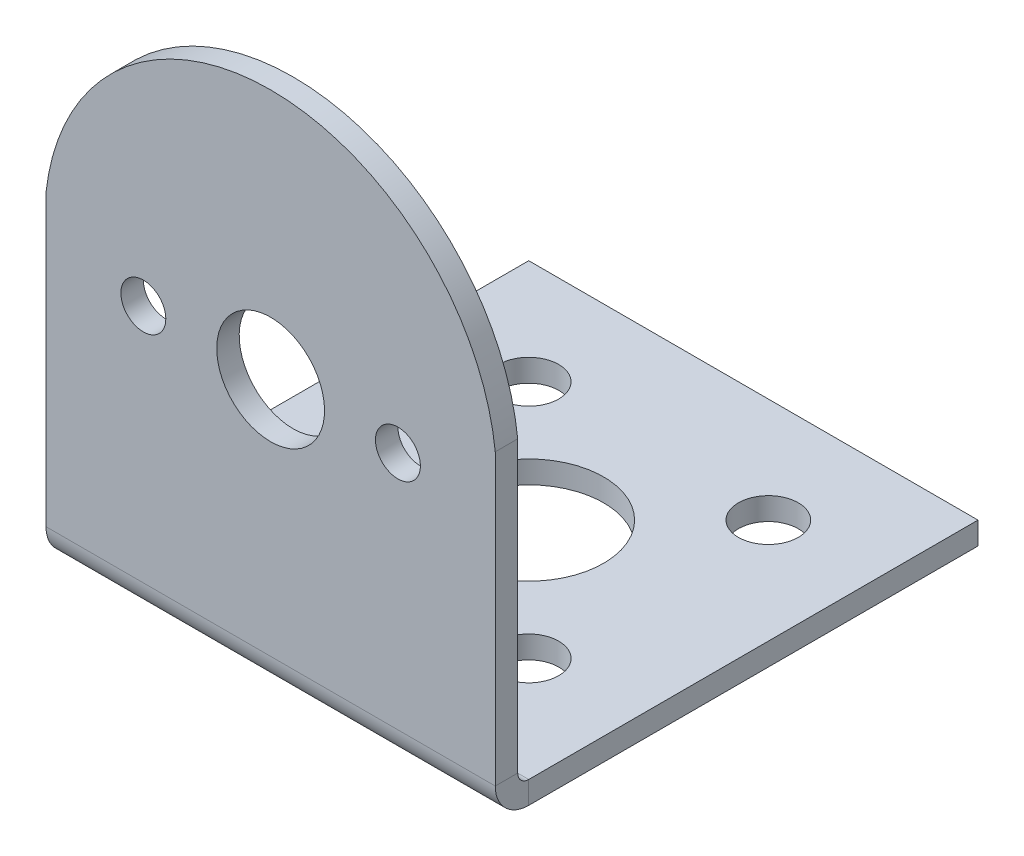
ISO-10303-21;
HEADER;
FILE_DESCRIPTION(('STEP AP214'),'2;1');
FILE_NAME('part.step','',(''),(''),'','','');
FILE_SCHEMA(('AUTOMOTIVE_DESIGN { 1 0 10303 214 1 1 1 1 }'));
ENDSEC;
DATA;
#1=APPLICATION_CONTEXT('core data for automotive mechanical design processes');
#2=APPLICATION_PROTOCOL_DEFINITION('international standard','automotive_design',2000,#1);
#3=PRODUCT_CONTEXT('',#1,'mechanical');
#4=PRODUCT('Part','Part','',(#3));
#5=PRODUCT_RELATED_PRODUCT_CATEGORY('part','',(#4));
#6=PRODUCT_DEFINITION_FORMATION('','',#4);
#7=PRODUCT_DEFINITION_CONTEXT('part definition',#1,'design');
#8=PRODUCT_DEFINITION('design','',#6,#7);
#9=PRODUCT_DEFINITION_SHAPE('','',#8);
#10=(LENGTH_UNIT() NAMED_UNIT(*) SI_UNIT(.MILLI.,.METRE.));
#11=(NAMED_UNIT(*) PLANE_ANGLE_UNIT() SI_UNIT($,.RADIAN.));
#12=(NAMED_UNIT(*) SI_UNIT($,.STERADIAN.) SOLID_ANGLE_UNIT());
#13=UNCERTAINTY_MEASURE_WITH_UNIT(LENGTH_MEASURE(1.E-05),#10,'distance_accuracy_value','');
#14=(GEOMETRIC_REPRESENTATION_CONTEXT(3) GLOBAL_UNCERTAINTY_ASSIGNED_CONTEXT((#13)) GLOBAL_UNIT_ASSIGNED_CONTEXT((#10,
#11,#12)) REPRESENTATION_CONTEXT('',''));
#15=CARTESIAN_POINT('',(0.,0.,0.));
#16=DIRECTION('',(0.,0.,1.));
#17=DIRECTION('',(1.,0.,0.));
#18=AXIS2_PLACEMENT_3D('',#15,#16,#17);
#19=CARTESIAN_POINT('',(-15.,-1.5,15.));
#20=DIRECTION('',(-1.,0.,0.));
#21=DIRECTION('',(0.,0.,1.));
#22=AXIS2_PLACEMENT_3D('',#19,#20,#21);
#23=PLANE('',#22);
#24=DIRECTION('',(0.,0.,1.));
#25=VECTOR('',#24,1.);
#26=CARTESIAN_POINT('',(-15.,0.,15.));
#27=LINE('',#26,#25);
#28=CARTESIAN_POINT('',(-15.,0.,-15.));
#29=VERTEX_POINT('',#28);
#30=CARTESIAN_POINT('',(-15.,0.,15.));
#31=VERTEX_POINT('',#30);
#32=EDGE_CURVE('E245',#29,#31,#27,.T.);
#33=ORIENTED_EDGE('',*,*,#32,.F.);
#34=DIRECTION('',(0.,1.,0.));
#35=VECTOR('',#34,1.);
#36=CARTESIAN_POINT('',(-15.,-1.5,-15.));
#37=LINE('',#36,#35);
#38=CARTESIAN_POINT('',(-15.,-1.5,-15.));
#39=VERTEX_POINT('',#38);
#40=EDGE_CURVE('E13',#39,#29,#37,.T.);
#41=ORIENTED_EDGE('',*,*,#40,.F.);
#42=DIRECTION('',(0.,0.,1.));
#43=VECTOR('',#42,1.);
#44=CARTESIAN_POINT('',(-15.,-1.5,15.));
#45=LINE('',#44,#43);
#46=CARTESIAN_POINT('',(-15.,-1.5,15.));
#47=VERTEX_POINT('',#46);
#48=EDGE_CURVE('E248',#39,#47,#45,.T.);
#49=ORIENTED_EDGE('',*,*,#48,.T.);
#50=DIRECTION('',(0.,1.,0.));
#51=VECTOR('',#50,1.);
#52=CARTESIAN_POINT('',(-15.,-1.5,15.));
#53=LINE('',#52,#51);
#54=EDGE_CURVE('E74',#47,#31,#53,.T.);
#55=ORIENTED_EDGE('',*,*,#54,.T.);
#56=EDGE_LOOP('',(#33,#41,#49,#55));
#57=FACE_BOUND('',#56,.T.);
#58=ADVANCED_FACE('F71',(#57),#23,.T.);
#59=CARTESIAN_POINT('',(15.,-1.5,-15.));
#60=DIRECTION('',(0.,0.,-1.));
#61=DIRECTION('',(-1.,0.,0.));
#62=AXIS2_PLACEMENT_3D('',#59,#60,#61);
#63=PLANE('',#62);
#64=DIRECTION('',(-1.,0.,0.));
#65=VECTOR('',#64,1.);
#66=CARTESIAN_POINT('',(15.,0.,-15.));
#67=LINE('',#66,#65);
#68=CARTESIAN_POINT('',(15.,0.,-15.));
#69=VERTEX_POINT('',#68);
#70=EDGE_CURVE('E250',#69,#29,#67,.T.);
#71=ORIENTED_EDGE('',*,*,#70,.F.);
#72=DIRECTION('',(0.,1.,0.));
#73=VECTOR('',#72,1.);
#74=CARTESIAN_POINT('',(15.,-1.5,-15.));
#75=LINE('',#74,#73);
#76=CARTESIAN_POINT('',(15.,-1.5,-15.));
#77=VERTEX_POINT('',#76);
#78=EDGE_CURVE('E80',#77,#69,#75,.T.);
#79=ORIENTED_EDGE('',*,*,#78,.F.);
#80=DIRECTION('',(-1.,0.,0.));
#81=VECTOR('',#80,1.);
#82=CARTESIAN_POINT('',(15.,-1.5,-15.));
#83=LINE('',#82,#81);
#84=EDGE_CURVE('E254',#77,#39,#83,.T.);
#85=ORIENTED_EDGE('',*,*,#84,.T.);
#86=ORIENTED_EDGE('',*,*,#40,.T.);
#87=EDGE_LOOP('',(#71,#79,#85,#86));
#88=FACE_BOUND('',#87,.T.);
#89=ADVANCED_FACE('F301',(#88),#63,.T.);
#90=CARTESIAN_POINT('',(15.,-1.5,15.));
#91=DIRECTION('',(1.,0.,0.));
#92=DIRECTION('',(0.,0.,-1.));
#93=AXIS2_PLACEMENT_3D('',#90,#91,#92);
#94=PLANE('',#93);
#95=DIRECTION('',(0.,0.,-1.));
#96=VECTOR('',#95,1.);
#97=CARTESIAN_POINT('',(15.,0.,15.));
#98=LINE('',#97,#96);
#99=CARTESIAN_POINT('',(15.,0.,15.));
#100=VERTEX_POINT('',#99);
#101=EDGE_CURVE('E261',#100,#69,#98,.T.);
#102=ORIENTED_EDGE('',*,*,#101,.F.);
#103=DIRECTION('',(0.,1.,0.));
#104=VECTOR('',#103,1.);
#105=CARTESIAN_POINT('',(15.,-1.5,15.));
#106=LINE('',#105,#104);
#107=CARTESIAN_POINT('',(15.,-1.50000000000001,15.));
#108=VERTEX_POINT('',#107);
#109=EDGE_CURVE('E265',#108,#100,#106,.T.);
#110=ORIENTED_EDGE('',*,*,#109,.F.);
#111=DIRECTION('',(0.,0.,-1.));
#112=VECTOR('',#111,1.);
#113=CARTESIAN_POINT('',(15.,-1.5,15.));
#114=LINE('',#113,#112);
#115=EDGE_CURVE('E252',#108,#77,#114,.T.);
#116=ORIENTED_EDGE('',*,*,#115,.T.);
#117=ORIENTED_EDGE('',*,*,#78,.T.);
#118=EDGE_LOOP('',(#102,#110,#116,#117));
#119=FACE_BOUND('',#118,.T.);
#120=ADVANCED_FACE('F305',(#119),#94,.T.);
#121=CARTESIAN_POINT('',(0.,-1.5,0.));
#122=DIRECTION('',(0.,1.,0.));
#123=DIRECTION('',(0.,0.,1.));
#124=AXIS2_PLACEMENT_3D('',#121,#122,#123);
#125=PLANE('',#124);
#126=CARTESIAN_POINT('',(-8.,-1.5,-7.99999999999999));
#127=DIRECTION('',(0.,1.,0.));
#128=DIRECTION('',(0.,0.,-1.));
#129=AXIS2_PLACEMENT_3D('',#126,#127,#128);
#130=CIRCLE('',#129,2.);
#131=CARTESIAN_POINT('',(-8.,-1.5,-9.99999999999999));
#132=VERTEX_POINT('',#131);
#133=EDGE_CURVE('E218',#132,#132,#130,.T.);
#134=ORIENTED_EDGE('',*,*,#133,.T.);
#135=EDGE_LOOP('',(#134));
#136=FACE_BOUND('',#135,.T.);
#137=CARTESIAN_POINT('',(-8.,-1.5,8.));
#138=DIRECTION('',(0.,1.,0.));
#139=DIRECTION('',(0.,0.,-1.));
#140=AXIS2_PLACEMENT_3D('',#137,#138,#139);
#141=CIRCLE('',#140,2.);
#142=CARTESIAN_POINT('',(-8.,-1.5,6.));
#143=VERTEX_POINT('',#142);
#144=EDGE_CURVE('E224',#143,#143,#141,.T.);
#145=ORIENTED_EDGE('',*,*,#144,.T.);
#146=EDGE_LOOP('',(#145));
#147=FACE_BOUND('',#146,.T.);
#148=CARTESIAN_POINT('',(8.,-1.5,8.));
#149=DIRECTION('',(0.,1.,0.));
#150=DIRECTION('',(0.,0.,1.));
#151=AXIS2_PLACEMENT_3D('',#148,#149,#150);
#152=CIRCLE('',#151,2.);
#153=CARTESIAN_POINT('',(8.,-1.5,10.));
#154=VERTEX_POINT('',#153);
#155=EDGE_CURVE('E230',#154,#154,#152,.T.);
#156=ORIENTED_EDGE('',*,*,#155,.T.);
#157=EDGE_LOOP('',(#156));
#158=FACE_BOUND('',#157,.T.);
#159=CARTESIAN_POINT('',(8.,-1.5,-7.99999999999999));
#160=DIRECTION('',(0.,1.,0.));
#161=DIRECTION('',(0.,0.,1.));
#162=AXIS2_PLACEMENT_3D('',#159,#160,#161);
#163=CIRCLE('',#162,2.);
#164=CARTESIAN_POINT('',(8.,-1.5,-5.99999999999999));
#165=VERTEX_POINT('',#164);
#166=EDGE_CURVE('E236',#165,#165,#163,.T.);
#167=ORIENTED_EDGE('',*,*,#166,.T.);
#168=EDGE_LOOP('',(#167));
#169=FACE_BOUND('',#168,.T.);
#170=CARTESIAN_POINT('',(0.,-1.5,0.));
#171=DIRECTION('',(0.,1.,0.));
#172=DIRECTION('',(0.,0.,1.));
#173=AXIS2_PLACEMENT_3D('',#170,#171,#172);
#174=CIRCLE('',#173,5.);
#175=CARTESIAN_POINT('',(0.,-1.5,5.));
#176=VERTEX_POINT('',#175);
#177=EDGE_CURVE('E242',#176,#176,#174,.T.);
#178=ORIENTED_EDGE('',*,*,#177,.T.);
#179=EDGE_LOOP('',(#178));
#180=FACE_BOUND('',#179,.T.);
#181=ORIENTED_EDGE('',*,*,#48,.F.);
#182=ORIENTED_EDGE('',*,*,#84,.F.);
#183=ORIENTED_EDGE('',*,*,#115,.F.);
#184=DIRECTION('',(1.,0.,0.));
#185=VECTOR('',#184,1.);
#186=CARTESIAN_POINT('',(15.,-1.5,15.));
#187=LINE('',#186,#185);
#188=EDGE_CURVE('E112',#47,#108,#187,.T.);
#189=ORIENTED_EDGE('',*,*,#188,.F.);
#190=EDGE_LOOP('',(#181,#182,#183,#189));
#191=FACE_BOUND('',#190,.T.);
#192=ADVANCED_FACE('F310',(#136,#147,#158,#169,#180,#191),#125,.F.);
#193=CARTESIAN_POINT('',(0.,0.,0.));
#194=DIRECTION('',(0.,1.,0.));
#195=DIRECTION('',(0.,0.,1.));
#196=AXIS2_PLACEMENT_3D('',#193,#194,#195);
#197=PLANE('',#196);
#198=CARTESIAN_POINT('',(-8.,0.,-7.99999999999999));
#199=DIRECTION('',(0.,1.,0.));
#200=DIRECTION('',(0.,0.,-1.));
#201=AXIS2_PLACEMENT_3D('',#198,#199,#200);
#202=CIRCLE('',#201,2.);
#203=CARTESIAN_POINT('',(-8.,0.,-9.99999999999999));
#204=VERTEX_POINT('',#203);
#205=EDGE_CURVE('E213',#204,#204,#202,.T.);
#206=ORIENTED_EDGE('',*,*,#205,.F.);
#207=EDGE_LOOP('',(#206));
#208=FACE_BOUND('',#207,.T.);
#209=CARTESIAN_POINT('',(-8.,0.,8.));
#210=DIRECTION('',(0.,1.,0.));
#211=DIRECTION('',(0.,0.,-1.));
#212=AXIS2_PLACEMENT_3D('',#209,#210,#211);
#213=CIRCLE('',#212,2.);
#214=CARTESIAN_POINT('',(-8.,0.,6.));
#215=VERTEX_POINT('',#214);
#216=EDGE_CURVE('E221',#215,#215,#213,.T.);
#217=ORIENTED_EDGE('',*,*,#216,.F.);
#218=EDGE_LOOP('',(#217));
#219=FACE_BOUND('',#218,.T.);
#220=CARTESIAN_POINT('',(8.,0.,8.));
#221=DIRECTION('',(0.,1.,0.));
#222=DIRECTION('',(0.,0.,1.));
#223=AXIS2_PLACEMENT_3D('',#220,#221,#222);
#224=CIRCLE('',#223,2.);
#225=CARTESIAN_POINT('',(8.,0.,10.));
#226=VERTEX_POINT('',#225);
#227=EDGE_CURVE('E227',#226,#226,#224,.T.);
#228=ORIENTED_EDGE('',*,*,#227,.F.);
#229=EDGE_LOOP('',(#228));
#230=FACE_BOUND('',#229,.T.);
#231=CARTESIAN_POINT('',(8.,0.,-7.99999999999999));
#232=DIRECTION('',(0.,1.,0.));
#233=DIRECTION('',(0.,0.,1.));
#234=AXIS2_PLACEMENT_3D('',#231,#232,#233);
#235=CIRCLE('',#234,2.);
#236=CARTESIAN_POINT('',(8.,0.,-5.99999999999999));
#237=VERTEX_POINT('',#236);
#238=EDGE_CURVE('E233',#237,#237,#235,.T.);
#239=ORIENTED_EDGE('',*,*,#238,.F.);
#240=EDGE_LOOP('',(#239));
#241=FACE_BOUND('',#240,.T.);
#242=CARTESIAN_POINT('',(0.,0.,0.));
#243=DIRECTION('',(0.,1.,0.));
#244=DIRECTION('',(0.,0.,1.));
#245=AXIS2_PLACEMENT_3D('',#242,#243,#244);
#246=CIRCLE('',#245,5.);
#247=CARTESIAN_POINT('',(0.,0.,5.));
#248=VERTEX_POINT('',#247);
#249=EDGE_CURVE('E239',#248,#248,#246,.T.);
#250=ORIENTED_EDGE('',*,*,#249,.F.);
#251=EDGE_LOOP('',(#250));
#252=FACE_BOUND('',#251,.T.);
#253=ORIENTED_EDGE('',*,*,#32,.T.);
#254=DIRECTION('',(1.,0.,0.));
#255=VECTOR('',#254,1.);
#256=CARTESIAN_POINT('',(15.,0.,15.));
#257=LINE('',#256,#255);
#258=EDGE_CURVE('E258',#31,#100,#257,.T.);
#259=ORIENTED_EDGE('',*,*,#258,.T.);
#260=ORIENTED_EDGE('',*,*,#101,.T.);
#261=ORIENTED_EDGE('',*,*,#70,.T.);
#262=EDGE_LOOP('',(#253,#259,#260,#261));
#263=FACE_BOUND('',#262,.T.);
#264=ADVANCED_FACE('F272',(#208,#219,#230,#241,#252,#263),#197,.T.);
#265=CARTESIAN_POINT('',(0.,-1.5,0.));
#266=DIRECTION('',(0.,1.,0.));
#267=DIRECTION('',(0.,0.,1.));
#268=AXIS2_PLACEMENT_3D('',#265,#266,#267);
#269=CYLINDRICAL_SURFACE('',#268,5.);
#270=ORIENTED_EDGE('',*,*,#177,.F.);
#271=EDGE_LOOP('',(#270));
#272=FACE_BOUND('',#271,.T.);
#273=ORIENTED_EDGE('',*,*,#249,.T.);
#274=EDGE_LOOP('',(#273));
#275=FACE_BOUND('',#274,.T.);
#276=ADVANCED_FACE('F314',(#272,#275),#269,.F.);
#277=CARTESIAN_POINT('',(8.,-1.5,-7.99999999999999));
#278=DIRECTION('',(0.,1.,0.));
#279=DIRECTION('',(0.,0.,1.));
#280=AXIS2_PLACEMENT_3D('',#277,#278,#279);
#281=CYLINDRICAL_SURFACE('',#280,2.);
#282=ORIENTED_EDGE('',*,*,#166,.F.);
#283=EDGE_LOOP('',(#282));
#284=FACE_BOUND('',#283,.T.);
#285=ORIENTED_EDGE('',*,*,#238,.T.);
#286=EDGE_LOOP('',(#285));
#287=FACE_BOUND('',#286,.T.);
#288=ADVANCED_FACE('F321',(#284,#287),#281,.F.);
#289=CARTESIAN_POINT('',(8.,-1.5,8.));
#290=DIRECTION('',(0.,1.,0.));
#291=DIRECTION('',(0.,0.,1.));
#292=AXIS2_PLACEMENT_3D('',#289,#290,#291);
#293=CYLINDRICAL_SURFACE('',#292,2.);
#294=ORIENTED_EDGE('',*,*,#155,.F.);
#295=EDGE_LOOP('',(#294));
#296=FACE_BOUND('',#295,.T.);
#297=ORIENTED_EDGE('',*,*,#227,.T.);
#298=EDGE_LOOP('',(#297));
#299=FACE_BOUND('',#298,.T.);
#300=ADVANCED_FACE('F325',(#296,#299),#293,.F.);
#301=CARTESIAN_POINT('',(-8.,-1.5,8.));
#302=DIRECTION('',(0.,1.,0.));
#303=DIRECTION('',(0.,0.,1.));
#304=AXIS2_PLACEMENT_3D('',#301,#302,#303);
#305=CYLINDRICAL_SURFACE('',#304,2.);
#306=ORIENTED_EDGE('',*,*,#144,.F.);
#307=EDGE_LOOP('',(#306));
#308=FACE_BOUND('',#307,.T.);
#309=ORIENTED_EDGE('',*,*,#216,.T.);
#310=EDGE_LOOP('',(#309));
#311=FACE_BOUND('',#310,.T.);
#312=ADVANCED_FACE('F329',(#308,#311),#305,.F.);
#313=CARTESIAN_POINT('',(-8.,-1.5,-7.99999999999999));
#314=DIRECTION('',(0.,1.,0.));
#315=DIRECTION('',(0.,0.,1.));
#316=AXIS2_PLACEMENT_3D('',#313,#314,#315);
#317=CYLINDRICAL_SURFACE('',#316,2.);
#318=ORIENTED_EDGE('',*,*,#133,.F.);
#319=EDGE_LOOP('',(#318));
#320=FACE_BOUND('',#319,.T.);
#321=ORIENTED_EDGE('',*,*,#205,.T.);
#322=EDGE_LOOP('',(#321));
#323=FACE_BOUND('',#322,.T.);
#324=ADVANCED_FACE('F333',(#320,#323),#317,.F.);
#325=CARTESIAN_POINT('',(-15.,0.736599999999997,15.));
#326=DIRECTION('',(-1.,0.,0.));
#327=DIRECTION('',(0.,-1.,0.));
#328=AXIS2_PLACEMENT_3D('',#325,#326,#327);
#329=PLANE('',#328);
#330=DIRECTION('',(0.,0.,1.));
#331=VECTOR('',#330,1.);
#332=CARTESIAN_POINT('',(-15.,0.736599999999997,17.2366000000001));
#333=LINE('',#332,#331);
#334=CARTESIAN_POINT('',(-15.,0.736599999999995,15.7366));
#335=VERTEX_POINT('',#334);
#336=CARTESIAN_POINT('',(-15.,0.73659999999999,17.2366));
#337=VERTEX_POINT('',#336);
#338=EDGE_CURVE('E210',#335,#337,#333,.T.);
#339=ORIENTED_EDGE('',*,*,#338,.F.);
#340=CARTESIAN_POINT('',(-15.,0.736599999999997,15.));
#341=DIRECTION('',(1.,0.,0.));
#342=DIRECTION('',(0.,1.,0.));
#343=AXIS2_PLACEMENT_3D('',#340,#341,#342);
#344=CIRCLE('',#343,0.736600000000004);
#345=EDGE_CURVE('E150',#31,#335,#344,.F.);
#346=ORIENTED_EDGE('',*,*,#345,.F.);
#347=ORIENTED_EDGE('',*,*,#54,.F.);
#348=CARTESIAN_POINT('',(-15.,0.736599999999997,15.));
#349=DIRECTION('',(1.,0.,0.));
#350=DIRECTION('',(0.,1.,0.));
#351=AXIS2_PLACEMENT_3D('',#348,#349,#350);
#352=CIRCLE('',#351,2.2366);
#353=EDGE_CURVE('E149',#47,#337,#352,.F.);
#354=ORIENTED_EDGE('',*,*,#353,.T.);
#355=EDGE_LOOP('',(#339,#346,#347,#354));
#356=FACE_BOUND('',#355,.T.);
#357=ADVANCED_FACE('F276',(#356),#329,.T.);
#358=CARTESIAN_POINT('',(15.,0.736599999999993,15.));
#359=DIRECTION('',(-1.,0.,0.));
#360=DIRECTION('',(0.,-1.,0.));
#361=AXIS2_PLACEMENT_3D('',#358,#359,#360);
#362=PLANE('',#361);
#363=CARTESIAN_POINT('',(15.,0.736599999999993,15.));
#364=DIRECTION('',(1.,0.,0.));
#365=DIRECTION('',(0.,1.,0.));
#366=AXIS2_PLACEMENT_3D('',#363,#364,#365);
#367=CIRCLE('',#366,0.736600000000004);
#368=CARTESIAN_POINT('',(15.,0.73659999999999,15.7366));
#369=VERTEX_POINT('',#368);
#370=EDGE_CURVE('E157',#369,#100,#367,.T.);
#371=ORIENTED_EDGE('',*,*,#370,.F.);
#372=DIRECTION('',(0.,0.,1.));
#373=VECTOR('',#372,1.);
#374=CARTESIAN_POINT('',(15.,0.736599999999993,15.7366));
#375=LINE('',#374,#373);
#376=CARTESIAN_POINT('',(15.,0.736599999999993,17.2366));
#377=VERTEX_POINT('',#376);
#378=EDGE_CURVE('E154',#369,#377,#375,.T.);
#379=ORIENTED_EDGE('',*,*,#378,.T.);
#380=CARTESIAN_POINT('',(15.,0.736599999999993,15.));
#381=DIRECTION('',(1.,0.,0.));
#382=DIRECTION('',(0.,1.,0.));
#383=AXIS2_PLACEMENT_3D('',#380,#381,#382);
#384=CIRCLE('',#383,2.2366);
#385=EDGE_CURVE('E140',#377,#108,#384,.T.);
#386=ORIENTED_EDGE('',*,*,#385,.T.);
#387=ORIENTED_EDGE('',*,*,#109,.T.);
#388=EDGE_LOOP('',(#371,#379,#386,#387));
#389=FACE_BOUND('',#388,.T.);
#390=ADVANCED_FACE('F155',(#389),#362,.F.);
#391=CARTESIAN_POINT('',(15.,0.736599999999993,15.));
#392=DIRECTION('',(1.,0.,0.));
#393=DIRECTION('',(0.,0.,1.));
#394=AXIS2_PLACEMENT_3D('',#391,#392,#393);
#395=CYLINDRICAL_SURFACE('',#394,2.2366);
#396=ORIENTED_EDGE('',*,*,#188,.T.);
#397=ORIENTED_EDGE('',*,*,#385,.F.);
#398=DIRECTION('',(1.,0.,0.));
#399=VECTOR('',#398,1.);
#400=CARTESIAN_POINT('',(0.,0.736599999999993,17.2366));
#401=LINE('',#400,#399);
#402=EDGE_CURVE('E145',#337,#377,#401,.T.);
#403=ORIENTED_EDGE('',*,*,#402,.F.);
#404=ORIENTED_EDGE('',*,*,#353,.F.);
#405=EDGE_LOOP('',(#396,#397,#403,#404));
#406=FACE_BOUND('',#405,.T.);
#407=ADVANCED_FACE('F142',(#406),#395,.T.);
#408=CARTESIAN_POINT('',(15.,0.736599999999993,15.));
#409=DIRECTION('',(1.,0.,0.));
#410=DIRECTION('',(0.,0.,1.));
#411=AXIS2_PLACEMENT_3D('',#408,#409,#410);
#412=CYLINDRICAL_SURFACE('',#411,0.736600000000004);
#413=ORIENTED_EDGE('',*,*,#258,.F.);
#414=ORIENTED_EDGE('',*,*,#345,.T.);
#415=DIRECTION('',(-1.,0.,0.));
#416=VECTOR('',#415,1.);
#417=CARTESIAN_POINT('',(-15.,0.736599999999997,15.7366));
#418=LINE('',#417,#416);
#419=EDGE_CURVE('E162',#335,#369,#418,.F.);
#420=ORIENTED_EDGE('',*,*,#419,.T.);
#421=ORIENTED_EDGE('',*,*,#370,.T.);
#422=EDGE_LOOP('',(#413,#414,#420,#421));
#423=FACE_BOUND('',#422,.T.);
#424=ADVANCED_FACE('F274',(#423),#412,.F.);
#425=CARTESIAN_POINT('',(15.,0.,17.2366));
#426=DIRECTION('',(1.,0.,0.));
#427=DIRECTION('',(0.,0.,-1.));
#428=AXIS2_PLACEMENT_3D('',#425,#426,#427);
#429=PLANE('',#428);
#430=DIRECTION('',(0.,-1.,0.));
#431=VECTOR('',#430,1.);
#432=CARTESIAN_POINT('',(15.,0.,17.2366));
#433=LINE('',#432,#431);
#434=CARTESIAN_POINT('',(15.,20.0671641791044,17.2366000000001));
#435=VERTEX_POINT('',#434);
#436=EDGE_CURVE('E169',#435,#377,#433,.T.);
#437=ORIENTED_EDGE('',*,*,#436,.T.);
#438=ORIENTED_EDGE('',*,*,#378,.F.);
#439=DIRECTION('',(0.,1.,0.));
#440=VECTOR('',#439,1.);
#441=CARTESIAN_POINT('',(15.,18.4085820895522,15.7366000000001));
#442=LINE('',#441,#440);
#443=CARTESIAN_POINT('',(15.,20.0671641791044,15.7366000000001));
#444=VERTEX_POINT('',#443);
#445=EDGE_CURVE('E185',#444,#369,#442,.F.);
#446=ORIENTED_EDGE('',*,*,#445,.F.);
#447=DIRECTION('',(0.,0.,-1.));
#448=VECTOR('',#447,1.);
#449=CARTESIAN_POINT('',(15.,20.0671641791044,17.2366000000001));
#450=LINE('',#449,#448);
#451=EDGE_CURVE('E174',#435,#444,#450,.T.);
#452=ORIENTED_EDGE('',*,*,#451,.F.);
#453=EDGE_LOOP('',(#437,#438,#446,#452));
#454=FACE_BOUND('',#453,.T.);
#455=ADVANCED_FACE('F173',(#454),#429,.T.);
#456=CARTESIAN_POINT('',(-15.,20.0671641791044,17.2366000000001));
#457=DIRECTION('',(-1.,0.,0.));
#458=DIRECTION('',(0.,-1.,0.));
#459=AXIS2_PLACEMENT_3D('',#456,#457,#458);
#460=PLANE('',#459);
#461=DIRECTION('',(0.,-1.,0.));
#462=VECTOR('',#461,1.);
#463=CARTESIAN_POINT('',(-15.,18.4085820895522,15.7366000000001));
#464=LINE('',#463,#462);
#465=CARTESIAN_POINT('',(-15.,20.0671641791044,15.7366000000001));
#466=VERTEX_POINT('',#465);
#467=EDGE_CURVE('E190',#335,#466,#464,.F.);
#468=ORIENTED_EDGE('',*,*,#467,.F.);
#469=ORIENTED_EDGE('',*,*,#338,.T.);
#470=DIRECTION('',(0.,1.,0.));
#471=VECTOR('',#470,1.);
#472=CARTESIAN_POINT('',(-15.,20.0671641791044,17.2366000000001));
#473=LINE('',#472,#471);
#474=CARTESIAN_POINT('',(-15.,20.0671641791044,17.2366000000001));
#475=VERTEX_POINT('',#474);
#476=EDGE_CURVE('E170',#337,#475,#473,.T.);
#477=ORIENTED_EDGE('',*,*,#476,.T.);
#478=DIRECTION('',(0.,0.,-1.));
#479=VECTOR('',#478,1.);
#480=CARTESIAN_POINT('',(-15.,20.0671641791044,17.2366000000001));
#481=LINE('',#480,#479);
#482=EDGE_CURVE('E176',#475,#466,#481,.T.);
#483=ORIENTED_EDGE('',*,*,#482,.T.);
#484=EDGE_LOOP('',(#468,#469,#477,#483));
#485=FACE_BOUND('',#484,.T.);
#486=ADVANCED_FACE('F279',(#485),#460,.T.);
#487=CARTESIAN_POINT('',(0.,18.4085820895522,17.2366000000001));
#488=DIRECTION('',(0.,0.,1.));
#489=DIRECTION('',(0.,-1.,0.));
#490=AXIS2_PLACEMENT_3D('',#487,#488,#489);
#491=PLANE('',#490);
#492=CARTESIAN_POINT('',(-8.5,16.7499999999999,17.2366000000001));
#493=DIRECTION('',(0.,0.,1.));
#494=DIRECTION('',(0.,-1.,0.));
#495=AXIS2_PLACEMENT_3D('',#492,#493,#494);
#496=CIRCLE('',#495,1.5);
#497=CARTESIAN_POINT('',(-8.5,15.2499999999999,17.2366));
#498=VERTEX_POINT('',#497);
#499=EDGE_CURVE('E204',#498,#498,#496,.F.);
#500=ORIENTED_EDGE('',*,*,#499,.T.);
#501=EDGE_LOOP('',(#500));
#502=FACE_BOUND('',#501,.T.);
#503=CARTESIAN_POINT('',(8.5,16.7499999999999,17.2366000000001));
#504=DIRECTION('',(0.,0.,1.));
#505=DIRECTION('',(0.,-1.,0.));
#506=AXIS2_PLACEMENT_3D('',#503,#504,#505);
#507=CIRCLE('',#506,1.5);
#508=CARTESIAN_POINT('',(8.5,15.2499999999999,17.2366));
#509=VERTEX_POINT('',#508);
#510=EDGE_CURVE('E198',#509,#509,#507,.F.);
#511=ORIENTED_EDGE('',*,*,#510,.T.);
#512=EDGE_LOOP('',(#511));
#513=FACE_BOUND('',#512,.T.);
#514=CARTESIAN_POINT('',(0.,16.7499999999999,17.2366000000001));
#515=DIRECTION('',(0.,0.,1.));
#516=DIRECTION('',(0.,-1.,0.));
#517=AXIS2_PLACEMENT_3D('',#514,#515,#516);
#518=CIRCLE('',#517,3.6);
#519=CARTESIAN_POINT('',(0.,13.1499999999999,17.2366));
#520=VERTEX_POINT('',#519);
#521=EDGE_CURVE('E192',#520,#520,#518,.F.);
#522=ORIENTED_EDGE('',*,*,#521,.T.);
#523=EDGE_LOOP('',(#522));
#524=FACE_BOUND('',#523,.T.);
#525=ORIENTED_EDGE('',*,*,#476,.F.);
#526=ORIENTED_EDGE('',*,*,#402,.T.);
#527=ORIENTED_EDGE('',*,*,#436,.F.);
#528=CARTESIAN_POINT('',(0.,18.4085820895522,17.2366000000001));
#529=DIRECTION('',(0.,0.,1.));
#530=DIRECTION('',(0.,-1.,0.));
#531=AXIS2_PLACEMENT_3D('',#528,#529,#530);
#532=CIRCLE('',#531,15.0914179104478);
#533=EDGE_CURVE('E177',#475,#435,#532,.F.);
#534=ORIENTED_EDGE('',*,*,#533,.F.);
#535=EDGE_LOOP('',(#525,#526,#527,#534));
#536=FACE_BOUND('',#535,.T.);
#537=ADVANCED_FACE('F167',(#502,#513,#524,#536),#491,.T.);
#538=CARTESIAN_POINT('',(0.,18.4085820895522,15.7366000000001));
#539=DIRECTION('',(0.,0.,1.));
#540=DIRECTION('',(0.,-1.,0.));
#541=AXIS2_PLACEMENT_3D('',#538,#539,#540);
#542=PLANE('',#541);
#543=CARTESIAN_POINT('',(0.,16.7499999999999,15.7366000000001));
#544=DIRECTION('',(0.,0.,1.));
#545=DIRECTION('',(0.,-1.,0.));
#546=AXIS2_PLACEMENT_3D('',#543,#544,#545);
#547=CIRCLE('',#546,3.6);
#548=CARTESIAN_POINT('',(0.,13.1499999999999,15.7366));
#549=VERTEX_POINT('',#548);
#550=EDGE_CURVE('E195',#549,#549,#547,.F.);
#551=ORIENTED_EDGE('',*,*,#550,.F.);
#552=EDGE_LOOP('',(#551));
#553=FACE_BOUND('',#552,.T.);
#554=CARTESIAN_POINT('',(8.5,16.7499999999999,15.7366000000001));
#555=DIRECTION('',(0.,0.,1.));
#556=DIRECTION('',(0.,-1.,0.));
#557=AXIS2_PLACEMENT_3D('',#554,#555,#556);
#558=CIRCLE('',#557,1.5);
#559=CARTESIAN_POINT('',(8.5,15.2499999999999,15.7366));
#560=VERTEX_POINT('',#559);
#561=EDGE_CURVE('E201',#560,#560,#558,.F.);
#562=ORIENTED_EDGE('',*,*,#561,.F.);
#563=EDGE_LOOP('',(#562));
#564=FACE_BOUND('',#563,.T.);
#565=CARTESIAN_POINT('',(-8.5,16.7499999999999,15.7366000000001));
#566=DIRECTION('',(0.,0.,1.));
#567=DIRECTION('',(0.,-1.,0.));
#568=AXIS2_PLACEMENT_3D('',#565,#566,#567);
#569=CIRCLE('',#568,1.5);
#570=CARTESIAN_POINT('',(-8.5,15.2499999999999,15.7366000000001));
#571=VERTEX_POINT('',#570);
#572=EDGE_CURVE('E171',#571,#571,#569,.F.);
#573=ORIENTED_EDGE('',*,*,#572,.F.);
#574=EDGE_LOOP('',(#573));
#575=FACE_BOUND('',#574,.T.);
#576=ORIENTED_EDGE('',*,*,#419,.F.);
#577=ORIENTED_EDGE('',*,*,#467,.T.);
#578=CARTESIAN_POINT('',(0.,18.4085820895522,15.7366000000001));
#579=DIRECTION('',(0.,0.,1.));
#580=DIRECTION('',(0.,-1.,0.));
#581=AXIS2_PLACEMENT_3D('',#578,#579,#580);
#582=CIRCLE('',#581,15.0914179104478);
#583=EDGE_CURVE('E187',#466,#444,#582,.F.);
#584=ORIENTED_EDGE('',*,*,#583,.T.);
#585=ORIENTED_EDGE('',*,*,#445,.T.);
#586=EDGE_LOOP('',(#576,#577,#584,#585));
#587=FACE_BOUND('',#586,.T.);
#588=ADVANCED_FACE('F283',(#553,#564,#575,#587),#542,.F.);
#589=CARTESIAN_POINT('',(0.,18.4085820895522,17.2366000000001));
#590=DIRECTION('',(0.,0.,-1.));
#591=DIRECTION('',(0.,1.,0.));
#592=AXIS2_PLACEMENT_3D('',#589,#590,#591);
#593=CYLINDRICAL_SURFACE('',#592,15.0914179104478);
#594=ORIENTED_EDGE('',*,*,#583,.F.);
#595=ORIENTED_EDGE('',*,*,#482,.F.);
#596=ORIENTED_EDGE('',*,*,#533,.T.);
#597=ORIENTED_EDGE('',*,*,#451,.T.);
#598=EDGE_LOOP('',(#594,#595,#596,#597));
#599=FACE_BOUND('',#598,.T.);
#600=ADVANCED_FACE('F285',(#599),#593,.T.);
#601=CARTESIAN_POINT('',(0.,16.7499999999999,17.2366000000001));
#602=DIRECTION('',(0.,0.,-1.));
#603=DIRECTION('',(0.,1.,0.));
#604=AXIS2_PLACEMENT_3D('',#601,#602,#603);
#605=CYLINDRICAL_SURFACE('',#604,3.6);
#606=ORIENTED_EDGE('',*,*,#521,.F.);
#607=EDGE_LOOP('',(#606));
#608=FACE_BOUND('',#607,.T.);
#609=ORIENTED_EDGE('',*,*,#550,.T.);
#610=EDGE_LOOP('',(#609));
#611=FACE_BOUND('',#610,.T.);
#612=ADVANCED_FACE('F287',(#608,#611),#605,.F.);
#613=CARTESIAN_POINT('',(8.5,16.7499999999999,17.2366000000001));
#614=DIRECTION('',(0.,0.,-1.));
#615=DIRECTION('',(0.,1.,0.));
#616=AXIS2_PLACEMENT_3D('',#613,#614,#615);
#617=CYLINDRICAL_SURFACE('',#616,1.5);
#618=ORIENTED_EDGE('',*,*,#510,.F.);
#619=EDGE_LOOP('',(#618));
#620=FACE_BOUND('',#619,.T.);
#621=ORIENTED_EDGE('',*,*,#561,.T.);
#622=EDGE_LOOP('',(#621));
#623=FACE_BOUND('',#622,.T.);
#624=ADVANCED_FACE('F293',(#620,#623),#617,.F.);
#625=CARTESIAN_POINT('',(-8.5,16.7499999999999,17.2366000000001));
#626=DIRECTION('',(0.,0.,-1.));
#627=DIRECTION('',(0.,1.,0.));
#628=AXIS2_PLACEMENT_3D('',#625,#626,#627);
#629=CYLINDRICAL_SURFACE('',#628,1.5);
#630=ORIENTED_EDGE('',*,*,#499,.F.);
#631=EDGE_LOOP('',(#630));
#632=FACE_BOUND('',#631,.T.);
#633=ORIENTED_EDGE('',*,*,#572,.T.);
#634=EDGE_LOOP('',(#633));
#635=FACE_BOUND('',#634,.T.);
#636=ADVANCED_FACE('F357',(#632,#635),#629,.F.);
#637=CLOSED_SHELL('',(#58,#89,#120,#192,#264,#276,#288,#300,#312,#324,#357,#390,#407,#424,#455,
#486,#537,#588,#600,#612,#624,#636));
#638=MANIFOLD_SOLID_BREP('B2',#637);
#639=ADVANCED_BREP_SHAPE_REPRESENTATION('',(#18,#638),#14);
#640=SHAPE_DEFINITION_REPRESENTATION(#9,#639);
ENDSEC;
END-ISO-10303-21;
